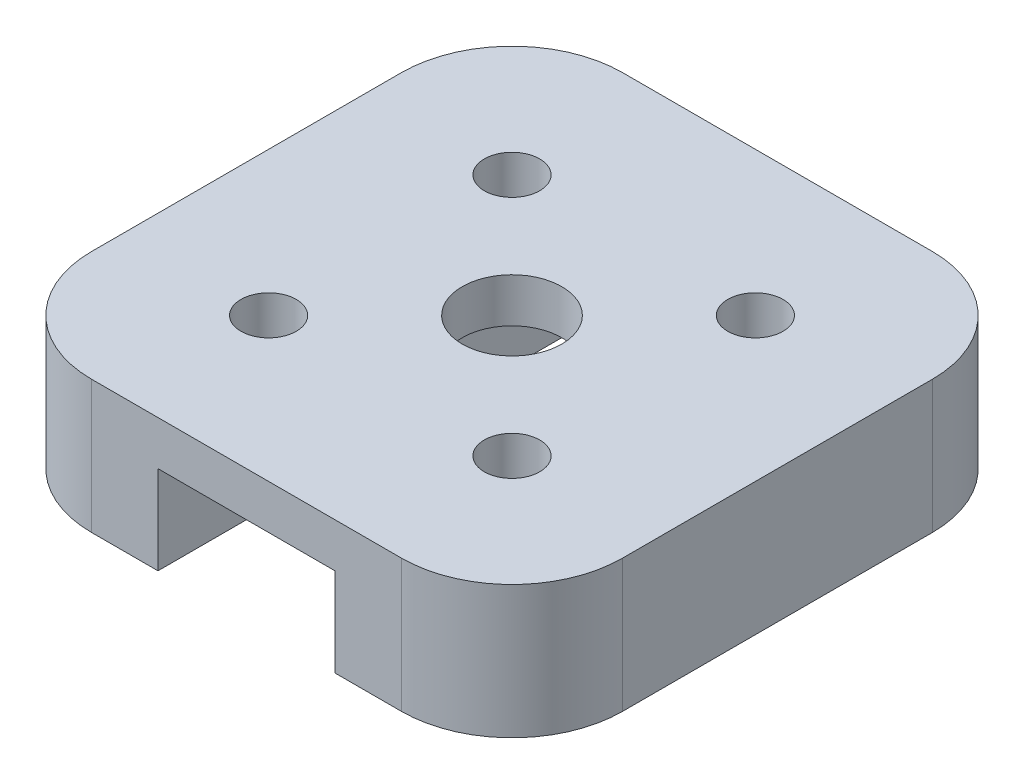
ISO-10303-21;
HEADER;
FILE_DESCRIPTION(('STEP AP214'),'2;1');
FILE_NAME('part.step','',(''),(''),'','','');
FILE_SCHEMA(('AUTOMOTIVE_DESIGN { 1 0 10303 214 1 1 1 1 }'));
ENDSEC;
DATA;
#1=APPLICATION_CONTEXT('core data for automotive mechanical design processes');
#2=APPLICATION_PROTOCOL_DEFINITION('international standard','automotive_design',2000,#1);
#3=PRODUCT_CONTEXT('',#1,'mechanical');
#4=PRODUCT('Part','Part','',(#3));
#5=PRODUCT_RELATED_PRODUCT_CATEGORY('part','',(#4));
#6=PRODUCT_DEFINITION_FORMATION('','',#4);
#7=PRODUCT_DEFINITION_CONTEXT('part definition',#1,'design');
#8=PRODUCT_DEFINITION('design','',#6,#7);
#9=PRODUCT_DEFINITION_SHAPE('','',#8);
#10=(LENGTH_UNIT() NAMED_UNIT(*) SI_UNIT(.MILLI.,.METRE.));
#11=(NAMED_UNIT(*) PLANE_ANGLE_UNIT() SI_UNIT($,.RADIAN.));
#12=(NAMED_UNIT(*) SI_UNIT($,.STERADIAN.) SOLID_ANGLE_UNIT());
#13=UNCERTAINTY_MEASURE_WITH_UNIT(LENGTH_MEASURE(1.E-05),#10,'distance_accuracy_value','');
#14=(GEOMETRIC_REPRESENTATION_CONTEXT(3) GLOBAL_UNCERTAINTY_ASSIGNED_CONTEXT((#13)) GLOBAL_UNIT_ASSIGNED_CONTEXT((#10,
#11,#12)) REPRESENTATION_CONTEXT('',''));
#15=CARTESIAN_POINT('',(0.,0.,0.));
#16=DIRECTION('',(0.,0.,1.));
#17=DIRECTION('',(1.,0.,0.));
#18=AXIS2_PLACEMENT_3D('',#15,#16,#17);
#19=CARTESIAN_POINT('',(-7.,0.,7.));
#20=DIRECTION('',(0.,1.,0.));
#21=DIRECTION('',(0.,0.,1.));
#22=AXIS2_PLACEMENT_3D('',#19,#20,#21);
#23=PLANE('',#22);
#24=CARTESIAN_POINT('',(-5.5,0.,5.5));
#25=DIRECTION('',(0.,1.,0.));
#26=DIRECTION('',(0.,0.,1.));
#27=AXIS2_PLACEMENT_3D('',#24,#25,#26);
#28=CIRCLE('',#27,1.25);
#29=CARTESIAN_POINT('',(-5.5,0.,6.75));
#30=VERTEX_POINT('',#29);
#31=EDGE_CURVE('E258',#30,#30,#28,.T.);
#32=ORIENTED_EDGE('',*,*,#31,.T.);
#33=EDGE_LOOP('',(#32));
#34=FACE_BOUND('',#33,.T.);
#35=CARTESIAN_POINT('',(-5.5,0.,-5.5));
#36=DIRECTION('',(0.,1.,0.));
#37=DIRECTION('',(0.,0.,1.));
#38=AXIS2_PLACEMENT_3D('',#35,#36,#37);
#39=CIRCLE('',#38,1.25);
#40=CARTESIAN_POINT('',(-5.5,0.,-4.25));
#41=VERTEX_POINT('',#40);
#42=EDGE_CURVE('E234',#41,#41,#39,.T.);
#43=ORIENTED_EDGE('',*,*,#42,.T.);
#44=EDGE_LOOP('',(#43));
#45=FACE_BOUND('',#44,.T.);
#46=DIRECTION('',(-1.,0.,0.));
#47=VECTOR('',#46,1.);
#48=CARTESIAN_POINT('',(-6.99999999999997,0.,-12.));
#49=LINE('',#48,#47);
#50=CARTESIAN_POINT('',(-4.,0.,-12.));
#51=VERTEX_POINT('',#50);
#52=CARTESIAN_POINT('',(-6.99999999999997,0.,-12.));
#53=VERTEX_POINT('',#52);
#54=EDGE_CURVE('E142',#51,#53,#49,.T.);
#55=ORIENTED_EDGE('',*,*,#54,.F.);
#56=DIRECTION('',(0.,0.,1.));
#57=VECTOR('',#56,1.);
#58=CARTESIAN_POINT('',(-4.,0.,-12.));
#59=LINE('',#58,#57);
#60=CARTESIAN_POINT('',(-4.,0.,12.));
#61=VERTEX_POINT('',#60);
#62=EDGE_CURVE('E281',#51,#61,#59,.T.);
#63=ORIENTED_EDGE('',*,*,#62,.T.);
#64=DIRECTION('',(1.,0.,0.));
#65=VECTOR('',#64,1.);
#66=CARTESIAN_POINT('',(-6.99999999999996,0.,12.));
#67=LINE('',#66,#65);
#68=CARTESIAN_POINT('',(-6.99999999999996,0.,12.));
#69=VERTEX_POINT('',#68);
#70=EDGE_CURVE('E163',#69,#61,#67,.T.);
#71=ORIENTED_EDGE('',*,*,#70,.F.);
#72=CARTESIAN_POINT('',(-7.,0.,7.));
#73=DIRECTION('',(0.,1.,0.));
#74=DIRECTION('',(0.,0.,1.));
#75=AXIS2_PLACEMENT_3D('',#72,#73,#74);
#76=CIRCLE('',#75,5.);
#77=CARTESIAN_POINT('',(-12.,0.,7.));
#78=VERTEX_POINT('',#77);
#79=EDGE_CURVE('E157',#78,#69,#76,.T.);
#80=ORIENTED_EDGE('',*,*,#79,.F.);
#81=DIRECTION('',(0.,0.,1.));
#82=VECTOR('',#81,1.);
#83=CARTESIAN_POINT('',(-12.,0.,-7.));
#84=LINE('',#83,#82);
#85=CARTESIAN_POINT('',(-12.,0.,-7.));
#86=VERTEX_POINT('',#85);
#87=EDGE_CURVE('E100',#86,#78,#84,.T.);
#88=ORIENTED_EDGE('',*,*,#87,.F.);
#89=CARTESIAN_POINT('',(-7.,0.,-7.));
#90=DIRECTION('',(0.,1.,0.));
#91=DIRECTION('',(0.,0.,1.));
#92=AXIS2_PLACEMENT_3D('',#89,#90,#91);
#93=CIRCLE('',#92,5.);
#94=EDGE_CURVE('E180',#53,#86,#93,.T.);
#95=ORIENTED_EDGE('',*,*,#94,.F.);
#96=EDGE_LOOP('',(#55,#63,#71,#80,#88,#95));
#97=FACE_BOUND('',#96,.T.);
#98=ADVANCED_FACE('F41',(#34,#45,#97),#23,.F.);
#99=CARTESIAN_POINT('',(-7.,6.,7.));
#100=DIRECTION('',(0.,1.,0.));
#101=DIRECTION('',(0.,0.,1.));
#102=AXIS2_PLACEMENT_3D('',#99,#100,#101);
#103=PLANE('',#102);
#104=CARTESIAN_POINT('',(-5.5,6.,5.5));
#105=DIRECTION('',(0.,1.,0.));
#106=DIRECTION('',(0.,0.,1.));
#107=AXIS2_PLACEMENT_3D('',#104,#105,#106);
#108=CIRCLE('',#107,1.25);
#109=CARTESIAN_POINT('',(-5.5,6.,6.75));
#110=VERTEX_POINT('',#109);
#111=EDGE_CURVE('E254',#110,#110,#108,.T.);
#112=ORIENTED_EDGE('',*,*,#111,.F.);
#113=EDGE_LOOP('',(#112));
#114=FACE_BOUND('',#113,.T.);
#115=CARTESIAN_POINT('',(5.5,6.,-5.5));
#116=DIRECTION('',(0.,1.,0.));
#117=DIRECTION('',(0.,0.,1.));
#118=AXIS2_PLACEMENT_3D('',#115,#116,#117);
#119=CIRCLE('',#118,1.25);
#120=CARTESIAN_POINT('',(5.5,6.,-4.25));
#121=VERTEX_POINT('',#120);
#122=EDGE_CURVE('E238',#121,#121,#119,.T.);
#123=ORIENTED_EDGE('',*,*,#122,.F.);
#124=EDGE_LOOP('',(#123));
#125=FACE_BOUND('',#124,.T.);
#126=CARTESIAN_POINT('',(-7.,6.,7.));
#127=DIRECTION('',(0.,1.,0.));
#128=DIRECTION('',(0.,0.,1.));
#129=AXIS2_PLACEMENT_3D('',#126,#127,#128);
#130=CIRCLE('',#129,5.);
#131=CARTESIAN_POINT('',(-12.,6.,7.));
#132=VERTEX_POINT('',#131);
#133=CARTESIAN_POINT('',(-6.99999999999996,6.,12.));
#134=VERTEX_POINT('',#133);
#135=EDGE_CURVE('E185',#132,#134,#130,.T.);
#136=ORIENTED_EDGE('',*,*,#135,.T.);
#137=DIRECTION('',(1.,0.,0.));
#138=VECTOR('',#137,1.);
#139=CARTESIAN_POINT('',(-6.99999999999996,6.,12.));
#140=LINE('',#139,#138);
#141=CARTESIAN_POINT('',(6.99999999999997,6.,12.));
#142=VERTEX_POINT('',#141);
#143=EDGE_CURVE('E108',#134,#142,#140,.T.);
#144=ORIENTED_EDGE('',*,*,#143,.T.);
#145=CARTESIAN_POINT('',(7.,6.,7.));
#146=DIRECTION('',(0.,1.,0.));
#147=DIRECTION('',(0.,0.,1.));
#148=AXIS2_PLACEMENT_3D('',#145,#146,#147);
#149=CIRCLE('',#148,5.);
#150=CARTESIAN_POINT('',(12.,6.,7.));
#151=VERTEX_POINT('',#150);
#152=EDGE_CURVE('E207',#142,#151,#149,.T.);
#153=ORIENTED_EDGE('',*,*,#152,.T.);
#154=DIRECTION('',(0.,0.,-1.));
#155=VECTOR('',#154,1.);
#156=CARTESIAN_POINT('',(12.,6.,-7.));
#157=LINE('',#156,#155);
#158=CARTESIAN_POINT('',(12.,6.,-7.));
#159=VERTEX_POINT('',#158);
#160=EDGE_CURVE('E224',#151,#159,#157,.T.);
#161=ORIENTED_EDGE('',*,*,#160,.T.);
#162=CARTESIAN_POINT('',(7.,6.,-7.));
#163=DIRECTION('',(0.,1.,0.));
#164=DIRECTION('',(0.,0.,-1.));
#165=AXIS2_PLACEMENT_3D('',#162,#163,#164);
#166=CIRCLE('',#165,5.);
#167=CARTESIAN_POINT('',(7.,6.,-12.));
#168=VERTEX_POINT('',#167);
#169=EDGE_CURVE('E131',#159,#168,#166,.T.);
#170=ORIENTED_EDGE('',*,*,#169,.T.);
#171=DIRECTION('',(-1.,0.,0.));
#172=VECTOR('',#171,1.);
#173=CARTESIAN_POINT('',(-6.99999999999997,6.,-12.));
#174=LINE('',#173,#172);
#175=CARTESIAN_POINT('',(-6.99999999999997,6.,-12.));
#176=VERTEX_POINT('',#175);
#177=EDGE_CURVE('E123',#168,#176,#174,.T.);
#178=ORIENTED_EDGE('',*,*,#177,.T.);
#179=CARTESIAN_POINT('',(-7.,6.,-7.));
#180=DIRECTION('',(0.,1.,0.));
#181=DIRECTION('',(0.,0.,1.));
#182=AXIS2_PLACEMENT_3D('',#179,#180,#181);
#183=CIRCLE('',#182,5.);
#184=CARTESIAN_POINT('',(-12.,6.,-7.));
#185=VERTEX_POINT('',#184);
#186=EDGE_CURVE('E128',#176,#185,#183,.T.);
#187=ORIENTED_EDGE('',*,*,#186,.T.);
#188=DIRECTION('',(0.,0.,1.));
#189=VECTOR('',#188,1.);
#190=CARTESIAN_POINT('',(-12.,6.,-7.));
#191=LINE('',#190,#189);
#192=EDGE_CURVE('E67',#185,#132,#191,.T.);
#193=ORIENTED_EDGE('',*,*,#192,.T.);
#194=EDGE_LOOP('',(#136,#144,#153,#161,#170,#178,#187,#193));
#195=FACE_BOUND('',#194,.T.);
#196=CARTESIAN_POINT('',(-5.5,6.,-5.5));
#197=DIRECTION('',(0.,1.,0.));
#198=DIRECTION('',(0.,0.,1.));
#199=AXIS2_PLACEMENT_3D('',#196,#197,#198);
#200=CIRCLE('',#199,1.25);
#201=CARTESIAN_POINT('',(-5.5,6.,-4.25));
#202=VERTEX_POINT('',#201);
#203=EDGE_CURVE('E162',#202,#202,#200,.T.);
#204=ORIENTED_EDGE('',*,*,#203,.F.);
#205=EDGE_LOOP('',(#204));
#206=FACE_BOUND('',#205,.T.);
#207=CARTESIAN_POINT('',(5.5,6.,5.5));
#208=DIRECTION('',(0.,1.,0.));
#209=DIRECTION('',(0.,0.,1.));
#210=AXIS2_PLACEMENT_3D('',#207,#208,#209);
#211=CIRCLE('',#210,1.25);
#212=CARTESIAN_POINT('',(5.5,6.,6.75));
#213=VERTEX_POINT('',#212);
#214=EDGE_CURVE('E246',#213,#213,#211,.T.);
#215=ORIENTED_EDGE('',*,*,#214,.F.);
#216=EDGE_LOOP('',(#215));
#217=FACE_BOUND('',#216,.T.);
#218=CARTESIAN_POINT('',(0.,6.,0.));
#219=DIRECTION('',(0.,1.,0.));
#220=DIRECTION('',(0.,0.,1.));
#221=AXIS2_PLACEMENT_3D('',#218,#219,#220);
#222=CIRCLE('',#221,2.25);
#223=CARTESIAN_POINT('',(0.,6.,2.25));
#224=VERTEX_POINT('',#223);
#225=EDGE_CURVE('E262',#224,#224,#222,.T.);
#226=ORIENTED_EDGE('',*,*,#225,.F.);
#227=EDGE_LOOP('',(#226));
#228=FACE_BOUND('',#227,.T.);
#229=ADVANCED_FACE('F125',(#114,#125,#195,#206,#217,#228),#103,.T.);
#230=CARTESIAN_POINT('',(4.,0.,12.));
#231=VERTEX_POINT('',#230);
#232=CARTESIAN_POINT('',(6.99999999999997,0.,12.));
#233=VERTEX_POINT('',#232);
#234=EDGE_CURVE('E161',#231,#233,#67,.T.);
#235=ORIENTED_EDGE('',*,*,#234,.F.);
#236=DIRECTION('',(0.,0.,1.));
#237=VECTOR('',#236,1.);
#238=CARTESIAN_POINT('',(4.,0.,-12.));
#239=LINE('',#238,#237);
#240=CARTESIAN_POINT('',(4.,0.,-12.));
#241=VERTEX_POINT('',#240);
#242=EDGE_CURVE('E285',#241,#231,#239,.T.);
#243=ORIENTED_EDGE('',*,*,#242,.F.);
#244=CARTESIAN_POINT('',(7.,0.,-12.));
#245=VERTEX_POINT('',#244);
#246=EDGE_CURVE('E176',#245,#241,#49,.T.);
#247=ORIENTED_EDGE('',*,*,#246,.F.);
#248=CARTESIAN_POINT('',(7.,0.,-7.));
#249=DIRECTION('',(0.,1.,0.));
#250=DIRECTION('',(0.,0.,-1.));
#251=AXIS2_PLACEMENT_3D('',#248,#249,#250);
#252=CIRCLE('',#251,5.);
#253=CARTESIAN_POINT('',(12.,0.,-7.));
#254=VERTEX_POINT('',#253);
#255=EDGE_CURVE('E173',#254,#245,#252,.T.);
#256=ORIENTED_EDGE('',*,*,#255,.F.);
#257=DIRECTION('',(0.,0.,-1.));
#258=VECTOR('',#257,1.);
#259=CARTESIAN_POINT('',(12.,0.,-7.));
#260=LINE('',#259,#258);
#261=CARTESIAN_POINT('',(12.,0.,7.));
#262=VERTEX_POINT('',#261);
#263=EDGE_CURVE('E170',#262,#254,#260,.T.);
#264=ORIENTED_EDGE('',*,*,#263,.F.);
#265=CARTESIAN_POINT('',(7.,0.,7.));
#266=DIRECTION('',(0.,1.,0.));
#267=DIRECTION('',(0.,0.,1.));
#268=AXIS2_PLACEMENT_3D('',#265,#266,#267);
#269=CIRCLE('',#268,5.);
#270=EDGE_CURVE('E167',#233,#262,#269,.T.);
#271=ORIENTED_EDGE('',*,*,#270,.F.);
#272=EDGE_LOOP('',(#235,#243,#247,#256,#264,#271));
#273=FACE_BOUND('',#272,.T.);
#274=CARTESIAN_POINT('',(5.5,0.,-5.5));
#275=DIRECTION('',(0.,1.,0.));
#276=DIRECTION('',(0.,0.,1.));
#277=AXIS2_PLACEMENT_3D('',#274,#275,#276);
#278=CIRCLE('',#277,1.25);
#279=CARTESIAN_POINT('',(5.5,0.,-4.25));
#280=VERTEX_POINT('',#279);
#281=EDGE_CURVE('E242',#280,#280,#278,.T.);
#282=ORIENTED_EDGE('',*,*,#281,.T.);
#283=EDGE_LOOP('',(#282));
#284=FACE_BOUND('',#283,.T.);
#285=CARTESIAN_POINT('',(5.5,0.,5.5));
#286=DIRECTION('',(0.,1.,0.));
#287=DIRECTION('',(0.,0.,1.));
#288=AXIS2_PLACEMENT_3D('',#285,#286,#287);
#289=CIRCLE('',#288,1.25);
#290=CARTESIAN_POINT('',(5.5,0.,6.75));
#291=VERTEX_POINT('',#290);
#292=EDGE_CURVE('E250',#291,#291,#289,.T.);
#293=ORIENTED_EDGE('',*,*,#292,.T.);
#294=EDGE_LOOP('',(#293));
#295=FACE_BOUND('',#294,.T.);
#296=ADVANCED_FACE('F211',(#273,#284,#295),#23,.F.);
#297=CARTESIAN_POINT('',(-7.,6.,7.));
#298=DIRECTION('',(0.,-1.,0.));
#299=DIRECTION('',(0.,0.,-1.));
#300=AXIS2_PLACEMENT_3D('',#297,#298,#299);
#301=CYLINDRICAL_SURFACE('',#300,5.);
#302=ORIENTED_EDGE('',*,*,#79,.T.);
#303=DIRECTION('',(0.,-1.,0.));
#304=VECTOR('',#303,1.);
#305=CARTESIAN_POINT('',(-6.99999999999996,6.,12.));
#306=LINE('',#305,#304);
#307=EDGE_CURVE('E11',#134,#69,#306,.T.);
#308=ORIENTED_EDGE('',*,*,#307,.F.);
#309=ORIENTED_EDGE('',*,*,#135,.F.);
#310=DIRECTION('',(0.,-1.,0.));
#311=VECTOR('',#310,1.);
#312=CARTESIAN_POINT('',(-12.,6.,7.));
#313=LINE('',#312,#311);
#314=EDGE_CURVE('E153',#132,#78,#313,.T.);
#315=ORIENTED_EDGE('',*,*,#314,.T.);
#316=EDGE_LOOP('',(#302,#308,#309,#315));
#317=FACE_BOUND('',#316,.T.);
#318=ADVANCED_FACE('F43',(#317),#301,.T.);
#319=CARTESIAN_POINT('',(-6.99999999999996,6.,12.));
#320=DIRECTION('',(0.,0.,-1.));
#321=DIRECTION('',(-1.,0.,0.));
#322=AXIS2_PLACEMENT_3D('',#319,#320,#321);
#323=PLANE('',#322);
#324=ORIENTED_EDGE('',*,*,#70,.T.);
#325=DIRECTION('',(0.,1.,0.));
#326=VECTOR('',#325,1.);
#327=CARTESIAN_POINT('',(-4.,6.,12.));
#328=LINE('',#327,#326);
#329=CARTESIAN_POINT('',(-4.,4.,12.));
#330=VERTEX_POINT('',#329);
#331=EDGE_CURVE('E269',#61,#330,#328,.T.);
#332=ORIENTED_EDGE('',*,*,#331,.T.);
#333=DIRECTION('',(1.,0.,0.));
#334=VECTOR('',#333,1.);
#335=CARTESIAN_POINT('',(-6.99999999999996,4.,12.));
#336=LINE('',#335,#334);
#337=CARTESIAN_POINT('',(4.,4.,12.));
#338=VERTEX_POINT('',#337);
#339=EDGE_CURVE('E277',#330,#338,#336,.T.);
#340=ORIENTED_EDGE('',*,*,#339,.T.);
#341=DIRECTION('',(0.,-1.,0.));
#342=VECTOR('',#341,1.);
#343=CARTESIAN_POINT('',(4.,6.,12.));
#344=LINE('',#343,#342);
#345=EDGE_CURVE('E273',#338,#231,#344,.T.);
#346=ORIENTED_EDGE('',*,*,#345,.T.);
#347=ORIENTED_EDGE('',*,*,#234,.T.);
#348=DIRECTION('',(0.,-1.,0.));
#349=VECTOR('',#348,1.);
#350=CARTESIAN_POINT('',(6.99999999999997,6.,12.));
#351=LINE('',#350,#349);
#352=EDGE_CURVE('E51',#142,#233,#351,.T.);
#353=ORIENTED_EDGE('',*,*,#352,.F.);
#354=ORIENTED_EDGE('',*,*,#143,.F.);
#355=ORIENTED_EDGE('',*,*,#307,.T.);
#356=EDGE_LOOP('',(#324,#332,#340,#346,#347,#353,#354,#355));
#357=FACE_BOUND('',#356,.T.);
#358=ADVANCED_FACE('F356',(#357),#323,.F.);
#359=CARTESIAN_POINT('',(7.,6.,7.));
#360=DIRECTION('',(0.,-1.,0.));
#361=DIRECTION('',(0.,0.,-1.));
#362=AXIS2_PLACEMENT_3D('',#359,#360,#361);
#363=CYLINDRICAL_SURFACE('',#362,5.);
#364=ORIENTED_EDGE('',*,*,#270,.T.);
#365=DIRECTION('',(0.,-1.,0.));
#366=VECTOR('',#365,1.);
#367=CARTESIAN_POINT('',(12.,6.,7.));
#368=LINE('',#367,#366);
#369=EDGE_CURVE('E196',#151,#262,#368,.T.);
#370=ORIENTED_EDGE('',*,*,#369,.F.);
#371=ORIENTED_EDGE('',*,*,#152,.F.);
#372=ORIENTED_EDGE('',*,*,#352,.T.);
#373=EDGE_LOOP('',(#364,#370,#371,#372));
#374=FACE_BOUND('',#373,.T.);
#375=ADVANCED_FACE('F205',(#374),#363,.T.);
#376=CARTESIAN_POINT('',(12.,6.,-7.));
#377=DIRECTION('',(-1.,0.,0.));
#378=DIRECTION('',(0.,0.,1.));
#379=AXIS2_PLACEMENT_3D('',#376,#377,#378);
#380=PLANE('',#379);
#381=ORIENTED_EDGE('',*,*,#263,.T.);
#382=DIRECTION('',(0.,-1.,0.));
#383=VECTOR('',#382,1.);
#384=CARTESIAN_POINT('',(12.,6.,-7.));
#385=LINE('',#384,#383);
#386=EDGE_CURVE('E192',#159,#254,#385,.T.);
#387=ORIENTED_EDGE('',*,*,#386,.F.);
#388=ORIENTED_EDGE('',*,*,#160,.F.);
#389=ORIENTED_EDGE('',*,*,#369,.T.);
#390=EDGE_LOOP('',(#381,#387,#388,#389));
#391=FACE_BOUND('',#390,.T.);
#392=ADVANCED_FACE('F219',(#391),#380,.F.);
#393=CARTESIAN_POINT('',(7.,6.,-7.));
#394=DIRECTION('',(0.,-1.,0.));
#395=DIRECTION('',(0.,0.,-1.));
#396=AXIS2_PLACEMENT_3D('',#393,#394,#395);
#397=CYLINDRICAL_SURFACE('',#396,5.);
#398=ORIENTED_EDGE('',*,*,#255,.T.);
#399=DIRECTION('',(0.,-1.,0.));
#400=VECTOR('',#399,1.);
#401=CARTESIAN_POINT('',(7.,6.,-12.));
#402=LINE('',#401,#400);
#403=EDGE_CURVE('E146',#168,#245,#402,.T.);
#404=ORIENTED_EDGE('',*,*,#403,.F.);
#405=ORIENTED_EDGE('',*,*,#169,.F.);
#406=ORIENTED_EDGE('',*,*,#386,.T.);
#407=EDGE_LOOP('',(#398,#404,#405,#406));
#408=FACE_BOUND('',#407,.T.);
#409=ADVANCED_FACE('F222',(#408),#397,.T.);
#410=CARTESIAN_POINT('',(-6.99999999999997,6.,-12.));
#411=DIRECTION('',(0.,0.,1.));
#412=DIRECTION('',(1.,0.,0.));
#413=AXIS2_PLACEMENT_3D('',#410,#411,#412);
#414=PLANE('',#413);
#415=DIRECTION('',(-1.,0.,0.));
#416=VECTOR('',#415,1.);
#417=CARTESIAN_POINT('',(-4.,4.,-12.));
#418=LINE('',#417,#416);
#419=CARTESIAN_POINT('',(4.,4.,-12.));
#420=VERTEX_POINT('',#419);
#421=CARTESIAN_POINT('',(-4.,4.,-12.));
#422=VERTEX_POINT('',#421);
#423=EDGE_CURVE('E58',#420,#422,#418,.T.);
#424=ORIENTED_EDGE('',*,*,#423,.T.);
#425=DIRECTION('',(0.,-1.,0.));
#426=VECTOR('',#425,1.);
#427=CARTESIAN_POINT('',(-4.,0.,-12.));
#428=LINE('',#427,#426);
#429=EDGE_CURVE('E302',#422,#51,#428,.T.);
#430=ORIENTED_EDGE('',*,*,#429,.T.);
#431=ORIENTED_EDGE('',*,*,#54,.T.);
#432=DIRECTION('',(0.,-1.,0.));
#433=VECTOR('',#432,1.);
#434=CARTESIAN_POINT('',(-6.99999999999997,6.,-12.));
#435=LINE('',#434,#433);
#436=EDGE_CURVE('E138',#176,#53,#435,.T.);
#437=ORIENTED_EDGE('',*,*,#436,.F.);
#438=ORIENTED_EDGE('',*,*,#177,.F.);
#439=ORIENTED_EDGE('',*,*,#403,.T.);
#440=ORIENTED_EDGE('',*,*,#246,.T.);
#441=DIRECTION('',(0.,1.,0.));
#442=VECTOR('',#441,1.);
#443=CARTESIAN_POINT('',(4.,0.,-12.));
#444=LINE('',#443,#442);
#445=EDGE_CURVE('E298',#241,#420,#444,.T.);
#446=ORIENTED_EDGE('',*,*,#445,.T.);
#447=EDGE_LOOP('',(#424,#430,#431,#437,#438,#439,#440,#446));
#448=FACE_BOUND('',#447,.T.);
#449=ADVANCED_FACE('F139',(#448),#414,.F.);
#450=CARTESIAN_POINT('',(-7.,6.,-7.));
#451=DIRECTION('',(0.,-1.,0.));
#452=DIRECTION('',(0.,0.,-1.));
#453=AXIS2_PLACEMENT_3D('',#450,#451,#452);
#454=CYLINDRICAL_SURFACE('',#453,5.);
#455=ORIENTED_EDGE('',*,*,#94,.T.);
#456=DIRECTION('',(0.,-1.,0.));
#457=VECTOR('',#456,1.);
#458=CARTESIAN_POINT('',(-12.,6.,-7.));
#459=LINE('',#458,#457);
#460=EDGE_CURVE('E147',#185,#86,#459,.T.);
#461=ORIENTED_EDGE('',*,*,#460,.F.);
#462=ORIENTED_EDGE('',*,*,#186,.F.);
#463=ORIENTED_EDGE('',*,*,#436,.T.);
#464=EDGE_LOOP('',(#455,#461,#462,#463));
#465=FACE_BOUND('',#464,.T.);
#466=ADVANCED_FACE('F149',(#465),#454,.T.);
#467=CARTESIAN_POINT('',(-12.,6.,-7.));
#468=DIRECTION('',(1.,0.,0.));
#469=DIRECTION('',(0.,0.,-1.));
#470=AXIS2_PLACEMENT_3D('',#467,#468,#469);
#471=PLANE('',#470);
#472=ORIENTED_EDGE('',*,*,#87,.T.);
#473=ORIENTED_EDGE('',*,*,#314,.F.);
#474=ORIENTED_EDGE('',*,*,#192,.F.);
#475=ORIENTED_EDGE('',*,*,#460,.T.);
#476=EDGE_LOOP('',(#472,#473,#474,#475));
#477=FACE_BOUND('',#476,.T.);
#478=ADVANCED_FACE('F344',(#477),#471,.F.);
#479=CARTESIAN_POINT('',(-5.5,6.,-5.5));
#480=DIRECTION('',(0.,-1.,0.));
#481=DIRECTION('',(0.,0.,-1.));
#482=AXIS2_PLACEMENT_3D('',#479,#480,#481);
#483=CYLINDRICAL_SURFACE('',#482,1.25);
#484=ORIENTED_EDGE('',*,*,#203,.T.);
#485=EDGE_LOOP('',(#484));
#486=FACE_BOUND('',#485,.T.);
#487=ORIENTED_EDGE('',*,*,#42,.F.);
#488=EDGE_LOOP('',(#487));
#489=FACE_BOUND('',#488,.T.);
#490=ADVANCED_FACE('F341',(#486,#489),#483,.F.);
#491=CARTESIAN_POINT('',(5.5,6.,-5.5));
#492=DIRECTION('',(0.,-1.,0.));
#493=DIRECTION('',(0.,0.,-1.));
#494=AXIS2_PLACEMENT_3D('',#491,#492,#493);
#495=CYLINDRICAL_SURFACE('',#494,1.25);
#496=ORIENTED_EDGE('',*,*,#122,.T.);
#497=EDGE_LOOP('',(#496));
#498=FACE_BOUND('',#497,.T.);
#499=ORIENTED_EDGE('',*,*,#281,.F.);
#500=EDGE_LOOP('',(#499));
#501=FACE_BOUND('',#500,.T.);
#502=ADVANCED_FACE('F389',(#498,#501),#495,.F.);
#503=CARTESIAN_POINT('',(5.5,6.,5.5));
#504=DIRECTION('',(0.,-1.,0.));
#505=DIRECTION('',(0.,0.,-1.));
#506=AXIS2_PLACEMENT_3D('',#503,#504,#505);
#507=CYLINDRICAL_SURFACE('',#506,1.25);
#508=ORIENTED_EDGE('',*,*,#214,.T.);
#509=EDGE_LOOP('',(#508));
#510=FACE_BOUND('',#509,.T.);
#511=ORIENTED_EDGE('',*,*,#292,.F.);
#512=EDGE_LOOP('',(#511));
#513=FACE_BOUND('',#512,.T.);
#514=ADVANCED_FACE('F386',(#510,#513),#507,.F.);
#515=CARTESIAN_POINT('',(-5.5,6.,5.5));
#516=DIRECTION('',(0.,-1.,0.));
#517=DIRECTION('',(0.,0.,-1.));
#518=AXIS2_PLACEMENT_3D('',#515,#516,#517);
#519=CYLINDRICAL_SURFACE('',#518,1.25);
#520=ORIENTED_EDGE('',*,*,#111,.T.);
#521=EDGE_LOOP('',(#520));
#522=FACE_BOUND('',#521,.T.);
#523=ORIENTED_EDGE('',*,*,#31,.F.);
#524=EDGE_LOOP('',(#523));
#525=FACE_BOUND('',#524,.T.);
#526=ADVANCED_FACE('F325',(#522,#525),#519,.F.);
#527=CARTESIAN_POINT('',(0.,6.,0.));
#528=DIRECTION('',(0.,-1.,0.));
#529=DIRECTION('',(0.,0.,-1.));
#530=AXIS2_PLACEMENT_3D('',#527,#528,#529);
#531=CYLINDRICAL_SURFACE('',#530,2.25);
#532=CARTESIAN_POINT('',(0.,4.,0.));
#533=DIRECTION('',(0.,1.,0.));
#534=DIRECTION('',(0.,0.,1.));
#535=AXIS2_PLACEMENT_3D('',#532,#533,#534);
#536=CIRCLE('',#535,2.25);
#537=CARTESIAN_POINT('',(0.,4.,2.25));
#538=VERTEX_POINT('',#537);
#539=EDGE_CURVE('E45',#538,#538,#536,.T.);
#540=ORIENTED_EDGE('',*,*,#539,.F.);
#541=EDGE_LOOP('',(#540));
#542=FACE_BOUND('',#541,.T.);
#543=ORIENTED_EDGE('',*,*,#225,.T.);
#544=EDGE_LOOP('',(#543));
#545=FACE_BOUND('',#544,.T.);
#546=ADVANCED_FACE('F321',(#542,#545),#531,.F.);
#547=CARTESIAN_POINT('',(-4.,0.,-12.));
#548=DIRECTION('',(-1.,0.,0.));
#549=DIRECTION('',(0.,0.,1.));
#550=AXIS2_PLACEMENT_3D('',#547,#548,#549);
#551=PLANE('',#550);
#552=ORIENTED_EDGE('',*,*,#62,.F.);
#553=ORIENTED_EDGE('',*,*,#429,.F.);
#554=DIRECTION('',(0.,0.,1.));
#555=VECTOR('',#554,1.);
#556=CARTESIAN_POINT('',(-4.,4.,-12.));
#557=LINE('',#556,#555);
#558=EDGE_CURVE('E292',#422,#330,#557,.T.);
#559=ORIENTED_EDGE('',*,*,#558,.T.);
#560=ORIENTED_EDGE('',*,*,#331,.F.);
#561=EDGE_LOOP('',(#552,#553,#559,#560));
#562=FACE_BOUND('',#561,.T.);
#563=ADVANCED_FACE('F324',(#562),#551,.F.);
#564=CARTESIAN_POINT('',(4.,0.,-12.));
#565=DIRECTION('',(1.,0.,0.));
#566=DIRECTION('',(0.,1.,0.));
#567=AXIS2_PLACEMENT_3D('',#564,#565,#566);
#568=PLANE('',#567);
#569=DIRECTION('',(0.,0.,1.));
#570=VECTOR('',#569,1.);
#571=CARTESIAN_POINT('',(4.,4.,-12.));
#572=LINE('',#571,#570);
#573=EDGE_CURVE('E289',#420,#338,#572,.T.);
#574=ORIENTED_EDGE('',*,*,#573,.F.);
#575=ORIENTED_EDGE('',*,*,#445,.F.);
#576=ORIENTED_EDGE('',*,*,#242,.T.);
#577=ORIENTED_EDGE('',*,*,#345,.F.);
#578=EDGE_LOOP('',(#574,#575,#576,#577));
#579=FACE_BOUND('',#578,.T.);
#580=ADVANCED_FACE('F374',(#579),#568,.F.);
#581=CARTESIAN_POINT('',(-4.,4.,-12.));
#582=DIRECTION('',(0.,1.,0.));
#583=DIRECTION('',(0.,0.,1.));
#584=AXIS2_PLACEMENT_3D('',#581,#582,#583);
#585=PLANE('',#584);
#586=ORIENTED_EDGE('',*,*,#539,.T.);
#587=EDGE_LOOP('',(#586));
#588=FACE_BOUND('',#587,.T.);
#589=ORIENTED_EDGE('',*,*,#558,.F.);
#590=ORIENTED_EDGE('',*,*,#423,.F.);
#591=ORIENTED_EDGE('',*,*,#573,.T.);
#592=ORIENTED_EDGE('',*,*,#339,.F.);
#593=EDGE_LOOP('',(#589,#590,#591,#592));
#594=FACE_BOUND('',#593,.T.);
#595=ADVANCED_FACE('F319',(#588,#594),#585,.F.);
#596=CLOSED_SHELL('',(#98,#229,#296,#318,#358,#375,#392,#409,#449,#466,#478,#490,#502,#514,#526,
#546,#563,#580,#595));
#597=MANIFOLD_SOLID_BREP('B2',#596);
#598=ADVANCED_BREP_SHAPE_REPRESENTATION('',(#18,#597),#14);
#599=SHAPE_DEFINITION_REPRESENTATION(#9,#598);
ENDSEC;
END-ISO-10303-21;
